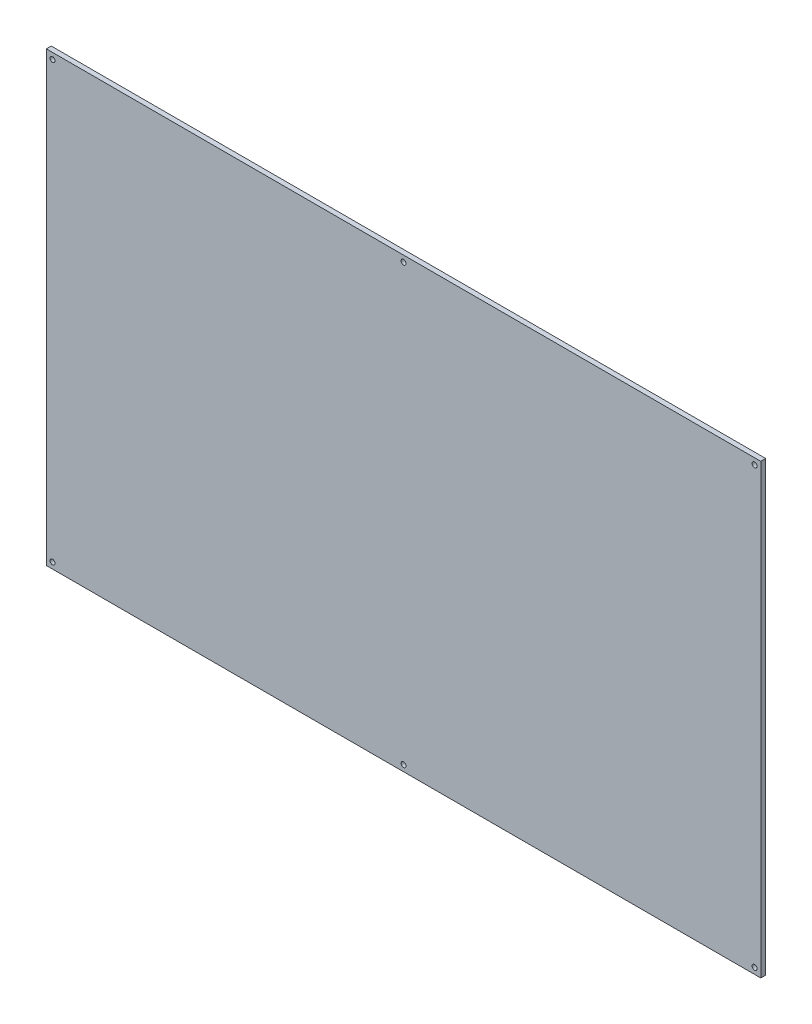
ISO-10303-21;
HEADER;
FILE_DESCRIPTION(('STEP AP214'),'2;1');
FILE_NAME('part.step','',(''),(''),'','','');
FILE_SCHEMA(('AUTOMOTIVE_DESIGN { 1 0 10303 214 1 1 1 1 }'));
ENDSEC;
DATA;
#1=APPLICATION_CONTEXT('core data for automotive mechanical design processes');
#2=APPLICATION_PROTOCOL_DEFINITION('international standard','automotive_design',2000,#1);
#3=PRODUCT_CONTEXT('',#1,'mechanical');
#4=PRODUCT('Part','Part','',(#3));
#5=PRODUCT_RELATED_PRODUCT_CATEGORY('part','',(#4));
#6=PRODUCT_DEFINITION_FORMATION('','',#4);
#7=PRODUCT_DEFINITION_CONTEXT('part definition',#1,'design');
#8=PRODUCT_DEFINITION('design','',#6,#7);
#9=PRODUCT_DEFINITION_SHAPE('','',#8);
#10=(LENGTH_UNIT() NAMED_UNIT(*) SI_UNIT(.MILLI.,.METRE.));
#11=(NAMED_UNIT(*) PLANE_ANGLE_UNIT() SI_UNIT($,.RADIAN.));
#12=(NAMED_UNIT(*) SI_UNIT($,.STERADIAN.) SOLID_ANGLE_UNIT());
#13=UNCERTAINTY_MEASURE_WITH_UNIT(LENGTH_MEASURE(1.E-05),#10,'distance_accuracy_value','');
#14=(GEOMETRIC_REPRESENTATION_CONTEXT(3) GLOBAL_UNCERTAINTY_ASSIGNED_CONTEXT((#13)) GLOBAL_UNIT_ASSIGNED_CONTEXT((#10,
#11,#12)) REPRESENTATION_CONTEXT('',''));
#15=CARTESIAN_POINT('',(0.,0.,0.));
#16=DIRECTION('',(0.,0.,1.));
#17=DIRECTION('',(1.,0.,0.));
#18=AXIS2_PLACEMENT_3D('',#15,#16,#17);
#19=CARTESIAN_POINT('',(0.,0.,2.));
#20=DIRECTION('',(0.,0.,1.));
#21=DIRECTION('',(1.,0.,0.));
#22=AXIS2_PLACEMENT_3D('',#19,#20,#21);
#23=PLANE('',#22);
#24=CARTESIAN_POINT('',(98.3283223319928,-150.828516057586,2.));
#25=DIRECTION('',(0.,0.,1.));
#26=DIRECTION('',(1.,0.,0.));
#27=AXIS2_PLACEMENT_3D('',#24,#25,#26);
#28=CIRCLE('',#27,0.999999999999998);
#29=CARTESIAN_POINT('',(99.3283223319928,-150.828516057586,2.));
#30=VERTEX_POINT('',#29);
#31=EDGE_CURVE('E132',#30,#30,#28,.T.);
#32=ORIENTED_EDGE('',*,*,#31,.F.);
#33=EDGE_LOOP('',(#32));
#34=FACE_BOUND('',#33,.T.);
#35=CARTESIAN_POINT('',(241.048322331993,26.0714839424142,2.));
#36=DIRECTION('',(0.,0.,1.));
#37=DIRECTION('',(1.,0.,0.));
#38=AXIS2_PLACEMENT_3D('',#35,#36,#37);
#39=CIRCLE('',#38,0.999999999999998);
#40=CARTESIAN_POINT('',(242.048322331993,26.0714839424142,2.));
#41=VERTEX_POINT('',#40);
#42=EDGE_CURVE('E120',#41,#41,#39,.T.);
#43=ORIENTED_EDGE('',*,*,#42,.F.);
#44=EDGE_LOOP('',(#43));
#45=FACE_BOUND('',#44,.T.);
#46=CARTESIAN_POINT('',(-44.3816776680072,26.0714839424142,2.));
#47=DIRECTION('',(0.,0.,1.));
#48=DIRECTION('',(1.,0.,0.));
#49=AXIS2_PLACEMENT_3D('',#46,#47,#48);
#50=CIRCLE('',#49,0.999999999999998);
#51=CARTESIAN_POINT('',(-43.3816776680072,26.0714839424142,2.));
#52=VERTEX_POINT('',#51);
#53=EDGE_CURVE('E99',#52,#52,#50,.T.);
#54=ORIENTED_EDGE('',*,*,#53,.F.);
#55=EDGE_LOOP('',(#54));
#56=FACE_BOUND('',#55,.T.);
#57=DIRECTION('',(0.,-1.,0.));
#58=VECTOR('',#57,1.);
#59=CARTESIAN_POINT('',(-46.8816776680072,28.5714839424142,2.));
#60=LINE('',#59,#58);
#61=CARTESIAN_POINT('',(-46.8816776680072,28.5714839424142,2.));
#62=VERTEX_POINT('',#61);
#63=CARTESIAN_POINT('',(-46.8816776680072,-153.328516057586,2.));
#64=VERTEX_POINT('',#63);
#65=EDGE_CURVE('E84',#62,#64,#60,.T.);
#66=ORIENTED_EDGE('',*,*,#65,.T.);
#67=DIRECTION('',(1.,0.,0.));
#68=VECTOR('',#67,1.);
#69=CARTESIAN_POINT('',(-46.8816776680072,-153.328516057586,2.));
#70=LINE('',#69,#68);
#71=CARTESIAN_POINT('',(243.548322331993,-153.328516057586,2.));
#72=VERTEX_POINT('',#71);
#73=EDGE_CURVE('E79',#64,#72,#70,.T.);
#74=ORIENTED_EDGE('',*,*,#73,.T.);
#75=DIRECTION('',(0.,1.,0.));
#76=VECTOR('',#75,1.);
#77=CARTESIAN_POINT('',(243.548322331993,28.5714839424142,2.));
#78=LINE('',#77,#76);
#79=CARTESIAN_POINT('',(243.548322331993,28.5714839424142,2.));
#80=VERTEX_POINT('',#79);
#81=EDGE_CURVE('E82',#72,#80,#78,.T.);
#82=ORIENTED_EDGE('',*,*,#81,.T.);
#83=DIRECTION('',(-1.,0.,0.));
#84=VECTOR('',#83,1.);
#85=CARTESIAN_POINT('',(-46.8816776680072,28.5714839424142,2.));
#86=LINE('',#85,#84);
#87=EDGE_CURVE('E49',#80,#62,#86,.T.);
#88=ORIENTED_EDGE('',*,*,#87,.T.);
#89=EDGE_LOOP('',(#66,#74,#82,#88));
#90=FACE_BOUND('',#89,.T.);
#91=CARTESIAN_POINT('',(98.3283223319928,26.0714839424142,2.));
#92=DIRECTION('',(0.,0.,1.));
#93=DIRECTION('',(1.,0.,0.));
#94=AXIS2_PLACEMENT_3D('',#91,#92,#93);
#95=CIRCLE('',#94,0.999999999999998);
#96=CARTESIAN_POINT('',(99.3283223319928,26.0714839424142,2.));
#97=VERTEX_POINT('',#96);
#98=EDGE_CURVE('E114',#97,#97,#95,.T.);
#99=ORIENTED_EDGE('',*,*,#98,.F.);
#100=EDGE_LOOP('',(#99));
#101=FACE_BOUND('',#100,.T.);
#102=CARTESIAN_POINT('',(241.048322331993,-150.828516057586,2.));
#103=DIRECTION('',(0.,0.,1.));
#104=DIRECTION('',(1.,0.,0.));
#105=AXIS2_PLACEMENT_3D('',#102,#103,#104);
#106=CIRCLE('',#105,0.999999999999998);
#107=CARTESIAN_POINT('',(242.048322331993,-150.828516057586,2.));
#108=VERTEX_POINT('',#107);
#109=EDGE_CURVE('E126',#108,#108,#106,.T.);
#110=ORIENTED_EDGE('',*,*,#109,.F.);
#111=EDGE_LOOP('',(#110));
#112=FACE_BOUND('',#111,.T.);
#113=CARTESIAN_POINT('',(-44.3816776680072,-150.828516057586,2.));
#114=DIRECTION('',(0.,0.,1.));
#115=DIRECTION('',(1.,0.,0.));
#116=AXIS2_PLACEMENT_3D('',#113,#114,#115);
#117=CIRCLE('',#116,0.999999999999998);
#118=CARTESIAN_POINT('',(-43.3816776680072,-150.828516057586,2.));
#119=VERTEX_POINT('',#118);
#120=EDGE_CURVE('E138',#119,#119,#117,.T.);
#121=ORIENTED_EDGE('',*,*,#120,.F.);
#122=EDGE_LOOP('',(#121));
#123=FACE_BOUND('',#122,.T.);
#124=ADVANCED_FACE('F32',(#34,#45,#56,#90,#101,#112,#123),#23,.T.);
#125=CARTESIAN_POINT('',(0.,0.,0.));
#126=DIRECTION('',(0.,0.,1.));
#127=DIRECTION('',(1.,0.,0.));
#128=AXIS2_PLACEMENT_3D('',#125,#126,#127);
#129=PLANE('',#128);
#130=CARTESIAN_POINT('',(98.3283223319928,-150.828516057586,0.));
#131=DIRECTION('',(0.,0.,1.));
#132=DIRECTION('',(1.,0.,0.));
#133=AXIS2_PLACEMENT_3D('',#130,#131,#132);
#134=CIRCLE('',#133,0.999999999999998);
#135=CARTESIAN_POINT('',(99.3283223319928,-150.828516057586,0.));
#136=VERTEX_POINT('',#135);
#137=EDGE_CURVE('E135',#136,#136,#134,.T.);
#138=ORIENTED_EDGE('',*,*,#137,.T.);
#139=EDGE_LOOP('',(#138));
#140=FACE_BOUND('',#139,.T.);
#141=CARTESIAN_POINT('',(241.048322331993,26.0714839424142,0.));
#142=DIRECTION('',(0.,0.,1.));
#143=DIRECTION('',(1.,0.,0.));
#144=AXIS2_PLACEMENT_3D('',#141,#142,#143);
#145=CIRCLE('',#144,0.999999999999998);
#146=CARTESIAN_POINT('',(242.048322331993,26.0714839424142,0.));
#147=VERTEX_POINT('',#146);
#148=EDGE_CURVE('E123',#147,#147,#145,.T.);
#149=ORIENTED_EDGE('',*,*,#148,.T.);
#150=EDGE_LOOP('',(#149));
#151=FACE_BOUND('',#150,.T.);
#152=CARTESIAN_POINT('',(-44.3816776680072,26.0714839424142,0.));
#153=DIRECTION('',(0.,0.,1.));
#154=DIRECTION('',(1.,0.,0.));
#155=AXIS2_PLACEMENT_3D('',#152,#153,#154);
#156=CIRCLE('',#155,0.999999999999998);
#157=CARTESIAN_POINT('',(-43.3816776680072,26.0714839424142,0.));
#158=VERTEX_POINT('',#157);
#159=EDGE_CURVE('E111',#158,#158,#156,.T.);
#160=ORIENTED_EDGE('',*,*,#159,.T.);
#161=EDGE_LOOP('',(#160));
#162=FACE_BOUND('',#161,.T.);
#163=DIRECTION('',(0.,-1.,0.));
#164=VECTOR('',#163,1.);
#165=CARTESIAN_POINT('',(-46.8816776680072,28.5714839424142,0.));
#166=LINE('',#165,#164);
#167=CARTESIAN_POINT('',(-46.8816776680072,28.5714839424142,0.));
#168=VERTEX_POINT('',#167);
#169=CARTESIAN_POINT('',(-46.8816776680072,-153.328516057586,0.));
#170=VERTEX_POINT('',#169);
#171=EDGE_CURVE('E96',#168,#170,#166,.T.);
#172=ORIENTED_EDGE('',*,*,#171,.F.);
#173=DIRECTION('',(-1.,0.,0.));
#174=VECTOR('',#173,1.);
#175=CARTESIAN_POINT('',(-46.8816776680072,28.5714839424142,0.));
#176=LINE('',#175,#174);
#177=CARTESIAN_POINT('',(243.548322331993,28.5714839424142,0.));
#178=VERTEX_POINT('',#177);
#179=EDGE_CURVE('E72',#178,#168,#176,.T.);
#180=ORIENTED_EDGE('',*,*,#179,.F.);
#181=DIRECTION('',(0.,1.,0.));
#182=VECTOR('',#181,1.);
#183=CARTESIAN_POINT('',(243.548322331993,28.5714839424142,0.));
#184=LINE('',#183,#182);
#185=CARTESIAN_POINT('',(243.548322331993,-153.328516057586,0.));
#186=VERTEX_POINT('',#185);
#187=EDGE_CURVE('E66',#186,#178,#184,.T.);
#188=ORIENTED_EDGE('',*,*,#187,.F.);
#189=DIRECTION('',(1.,0.,0.));
#190=VECTOR('',#189,1.);
#191=CARTESIAN_POINT('',(-46.8816776680072,-153.328516057586,0.));
#192=LINE('',#191,#190);
#193=EDGE_CURVE('E88',#170,#186,#192,.T.);
#194=ORIENTED_EDGE('',*,*,#193,.F.);
#195=EDGE_LOOP('',(#172,#180,#188,#194));
#196=FACE_BOUND('',#195,.T.);
#197=CARTESIAN_POINT('',(98.3283223319928,26.0714839424142,0.));
#198=DIRECTION('',(0.,0.,1.));
#199=DIRECTION('',(1.,0.,0.));
#200=AXIS2_PLACEMENT_3D('',#197,#198,#199);
#201=CIRCLE('',#200,0.999999999999998);
#202=CARTESIAN_POINT('',(99.3283223319928,26.0714839424142,0.));
#203=VERTEX_POINT('',#202);
#204=EDGE_CURVE('E117',#203,#203,#201,.T.);
#205=ORIENTED_EDGE('',*,*,#204,.T.);
#206=EDGE_LOOP('',(#205));
#207=FACE_BOUND('',#206,.T.);
#208=CARTESIAN_POINT('',(241.048322331993,-150.828516057586,0.));
#209=DIRECTION('',(0.,0.,1.));
#210=DIRECTION('',(1.,0.,0.));
#211=AXIS2_PLACEMENT_3D('',#208,#209,#210);
#212=CIRCLE('',#211,0.999999999999998);
#213=CARTESIAN_POINT('',(242.048322331993,-150.828516057586,0.));
#214=VERTEX_POINT('',#213);
#215=EDGE_CURVE('E129',#214,#214,#212,.T.);
#216=ORIENTED_EDGE('',*,*,#215,.T.);
#217=EDGE_LOOP('',(#216));
#218=FACE_BOUND('',#217,.T.);
#219=CARTESIAN_POINT('',(-44.3816776680072,-150.828516057586,0.));
#220=DIRECTION('',(0.,0.,1.));
#221=DIRECTION('',(1.,0.,0.));
#222=AXIS2_PLACEMENT_3D('',#219,#220,#221);
#223=CIRCLE('',#222,0.999999999999998);
#224=CARTESIAN_POINT('',(-43.3816776680072,-150.828516057586,0.));
#225=VERTEX_POINT('',#224);
#226=EDGE_CURVE('E141',#225,#225,#223,.T.);
#227=ORIENTED_EDGE('',*,*,#226,.T.);
#228=EDGE_LOOP('',(#227));
#229=FACE_BOUND('',#228,.T.);
#230=ADVANCED_FACE('F107',(#140,#151,#162,#196,#207,#218,#229),#129,.F.);
#231=CARTESIAN_POINT('',(-46.8816776680072,28.5714839424142,2.));
#232=DIRECTION('',(1.,0.,0.));
#233=DIRECTION('',(0.,1.,0.));
#234=AXIS2_PLACEMENT_3D('',#231,#232,#233);
#235=PLANE('',#234);
#236=ORIENTED_EDGE('',*,*,#171,.T.);
#237=DIRECTION('',(0.,0.,-1.));
#238=VECTOR('',#237,1.);
#239=CARTESIAN_POINT('',(-46.8816776680072,-153.328516057586,2.));
#240=LINE('',#239,#238);
#241=EDGE_CURVE('E11',#64,#170,#240,.T.);
#242=ORIENTED_EDGE('',*,*,#241,.F.);
#243=ORIENTED_EDGE('',*,*,#65,.F.);
#244=DIRECTION('',(0.,0.,-1.));
#245=VECTOR('',#244,1.);
#246=CARTESIAN_POINT('',(-46.8816776680072,28.5714839424142,2.));
#247=LINE('',#246,#245);
#248=EDGE_CURVE('E92',#62,#168,#247,.T.);
#249=ORIENTED_EDGE('',*,*,#248,.T.);
#250=EDGE_LOOP('',(#236,#242,#243,#249));
#251=FACE_BOUND('',#250,.T.);
#252=ADVANCED_FACE('F34',(#251),#235,.F.);
#253=CARTESIAN_POINT('',(-46.8816776680072,-153.328516057586,2.));
#254=DIRECTION('',(0.,1.,0.));
#255=DIRECTION('',(0.,0.,1.));
#256=AXIS2_PLACEMENT_3D('',#253,#254,#255);
#257=PLANE('',#256);
#258=ORIENTED_EDGE('',*,*,#193,.T.);
#259=DIRECTION('',(0.,0.,-1.));
#260=VECTOR('',#259,1.);
#261=CARTESIAN_POINT('',(243.548322331993,-153.328516057586,2.));
#262=LINE('',#261,#260);
#263=EDGE_CURVE('E41',#72,#186,#262,.T.);
#264=ORIENTED_EDGE('',*,*,#263,.F.);
#265=ORIENTED_EDGE('',*,*,#73,.F.);
#266=ORIENTED_EDGE('',*,*,#241,.T.);
#267=EDGE_LOOP('',(#258,#264,#265,#266));
#268=FACE_BOUND('',#267,.T.);
#269=ADVANCED_FACE('F87',(#268),#257,.F.);
#270=CARTESIAN_POINT('',(243.548322331993,28.5714839424142,2.));
#271=DIRECTION('',(-1.,0.,0.));
#272=DIRECTION('',(0.,-1.,0.));
#273=AXIS2_PLACEMENT_3D('',#270,#271,#272);
#274=PLANE('',#273);
#275=ORIENTED_EDGE('',*,*,#187,.T.);
#276=DIRECTION('',(0.,0.,-1.));
#277=VECTOR('',#276,1.);
#278=CARTESIAN_POINT('',(243.548322331993,28.5714839424142,2.));
#279=LINE('',#278,#277);
#280=EDGE_CURVE('E89',#80,#178,#279,.T.);
#281=ORIENTED_EDGE('',*,*,#280,.F.);
#282=ORIENTED_EDGE('',*,*,#81,.F.);
#283=ORIENTED_EDGE('',*,*,#263,.T.);
#284=EDGE_LOOP('',(#275,#281,#282,#283));
#285=FACE_BOUND('',#284,.T.);
#286=ADVANCED_FACE('F90',(#285),#274,.F.);
#287=CARTESIAN_POINT('',(-46.8816776680072,28.5714839424142,2.));
#288=DIRECTION('',(0.,-1.,0.));
#289=DIRECTION('',(0.,0.,-1.));
#290=AXIS2_PLACEMENT_3D('',#287,#288,#289);
#291=PLANE('',#290);
#292=ORIENTED_EDGE('',*,*,#179,.T.);
#293=ORIENTED_EDGE('',*,*,#248,.F.);
#294=ORIENTED_EDGE('',*,*,#87,.F.);
#295=ORIENTED_EDGE('',*,*,#280,.T.);
#296=EDGE_LOOP('',(#292,#293,#294,#295));
#297=FACE_BOUND('',#296,.T.);
#298=ADVANCED_FACE('F104',(#297),#291,.F.);
#299=CARTESIAN_POINT('',(-44.3816776680072,26.0714839424142,2.));
#300=DIRECTION('',(0.,0.,-1.));
#301=DIRECTION('',(-1.,0.,0.));
#302=AXIS2_PLACEMENT_3D('',#299,#300,#301);
#303=CYLINDRICAL_SURFACE('',#302,0.999999999999998);
#304=ORIENTED_EDGE('',*,*,#53,.T.);
#305=EDGE_LOOP('',(#304));
#306=FACE_BOUND('',#305,.T.);
#307=ORIENTED_EDGE('',*,*,#159,.F.);
#308=EDGE_LOOP('',(#307));
#309=FACE_BOUND('',#308,.T.);
#310=ADVANCED_FACE('F161',(#306,#309),#303,.F.);
#311=CARTESIAN_POINT('',(98.3283223319928,26.0714839424142,2.));
#312=DIRECTION('',(0.,0.,-1.));
#313=DIRECTION('',(-1.,0.,0.));
#314=AXIS2_PLACEMENT_3D('',#311,#312,#313);
#315=CYLINDRICAL_SURFACE('',#314,0.999999999999998);
#316=ORIENTED_EDGE('',*,*,#98,.T.);
#317=EDGE_LOOP('',(#316));
#318=FACE_BOUND('',#317,.T.);
#319=ORIENTED_EDGE('',*,*,#204,.F.);
#320=EDGE_LOOP('',(#319));
#321=FACE_BOUND('',#320,.T.);
#322=ADVANCED_FACE('F207',(#318,#321),#315,.F.);
#323=CARTESIAN_POINT('',(241.048322331993,26.0714839424142,2.));
#324=DIRECTION('',(0.,0.,-1.));
#325=DIRECTION('',(-1.,0.,0.));
#326=AXIS2_PLACEMENT_3D('',#323,#324,#325);
#327=CYLINDRICAL_SURFACE('',#326,0.999999999999998);
#328=ORIENTED_EDGE('',*,*,#42,.T.);
#329=EDGE_LOOP('',(#328));
#330=FACE_BOUND('',#329,.T.);
#331=ORIENTED_EDGE('',*,*,#148,.F.);
#332=EDGE_LOOP('',(#331));
#333=FACE_BOUND('',#332,.T.);
#334=ADVANCED_FACE('F215',(#330,#333),#327,.F.);
#335=CARTESIAN_POINT('',(241.048322331993,-150.828516057586,2.));
#336=DIRECTION('',(0.,0.,-1.));
#337=DIRECTION('',(-1.,0.,0.));
#338=AXIS2_PLACEMENT_3D('',#335,#336,#337);
#339=CYLINDRICAL_SURFACE('',#338,0.999999999999998);
#340=ORIENTED_EDGE('',*,*,#109,.T.);
#341=EDGE_LOOP('',(#340));
#342=FACE_BOUND('',#341,.T.);
#343=ORIENTED_EDGE('',*,*,#215,.F.);
#344=EDGE_LOOP('',(#343));
#345=FACE_BOUND('',#344,.T.);
#346=ADVANCED_FACE('F223',(#342,#345),#339,.F.);
#347=CARTESIAN_POINT('',(98.3283223319928,-150.828516057586,2.));
#348=DIRECTION('',(0.,0.,-1.));
#349=DIRECTION('',(-1.,0.,0.));
#350=AXIS2_PLACEMENT_3D('',#347,#348,#349);
#351=CYLINDRICAL_SURFACE('',#350,0.999999999999998);
#352=ORIENTED_EDGE('',*,*,#31,.T.);
#353=EDGE_LOOP('',(#352));
#354=FACE_BOUND('',#353,.T.);
#355=ORIENTED_EDGE('',*,*,#137,.F.);
#356=EDGE_LOOP('',(#355));
#357=FACE_BOUND('',#356,.T.);
#358=ADVANCED_FACE('F232',(#354,#357),#351,.F.);
#359=CARTESIAN_POINT('',(-44.3816776680072,-150.828516057586,2.));
#360=DIRECTION('',(0.,0.,-1.));
#361=DIRECTION('',(-1.,0.,0.));
#362=AXIS2_PLACEMENT_3D('',#359,#360,#361);
#363=CYLINDRICAL_SURFACE('',#362,0.999999999999998);
#364=ORIENTED_EDGE('',*,*,#120,.T.);
#365=EDGE_LOOP('',(#364));
#366=FACE_BOUND('',#365,.T.);
#367=ORIENTED_EDGE('',*,*,#226,.F.);
#368=EDGE_LOOP('',(#367));
#369=FACE_BOUND('',#368,.T.);
#370=ADVANCED_FACE('F147',(#366,#369),#363,.F.);
#371=CLOSED_SHELL('',(#124,#230,#252,#269,#286,#298,#310,#322,#334,#346,#358,#370));
#372=MANIFOLD_SOLID_BREP('B2',#371);
#373=ADVANCED_BREP_SHAPE_REPRESENTATION('',(#18,#372),#14);
#374=SHAPE_DEFINITION_REPRESENTATION(#9,#373);
ENDSEC;
END-ISO-10303-21;
